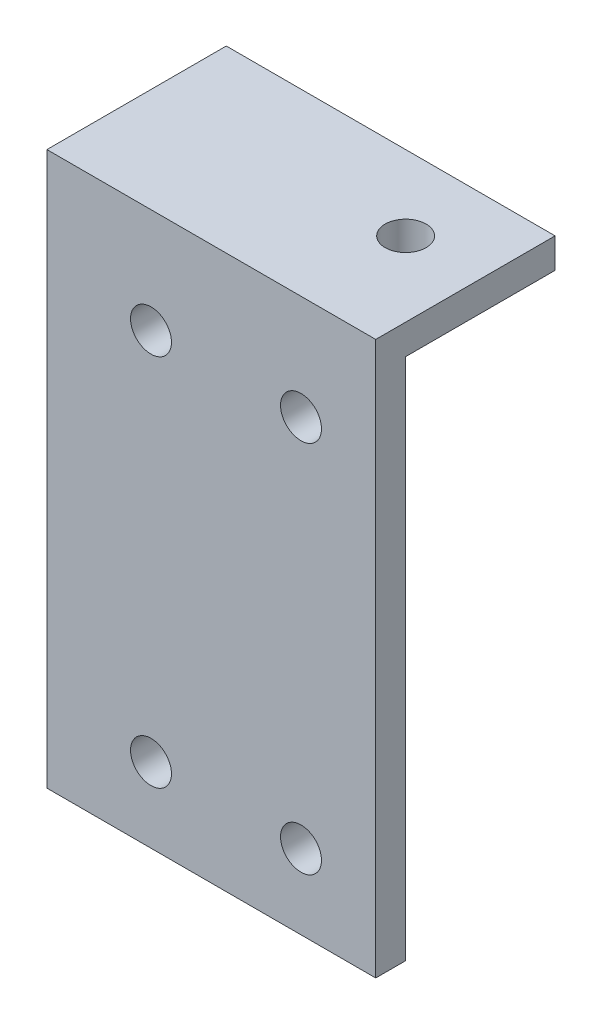
ISO-10303-21;
HEADER;
FILE_DESCRIPTION(('STEP AP214'),'2;1');
FILE_NAME('part.step','',(''),(''),'','','');
FILE_SCHEMA(('AUTOMOTIVE_DESIGN { 1 0 10303 214 1 1 1 1 }'));
ENDSEC;
DATA;
#1=APPLICATION_CONTEXT('core data for automotive mechanical design processes');
#2=APPLICATION_PROTOCOL_DEFINITION('international standard','automotive_design',2000,#1);
#3=PRODUCT_CONTEXT('',#1,'mechanical');
#4=PRODUCT('Part','Part','',(#3));
#5=PRODUCT_RELATED_PRODUCT_CATEGORY('part','',(#4));
#6=PRODUCT_DEFINITION_FORMATION('','',#4);
#7=PRODUCT_DEFINITION_CONTEXT('part definition',#1,'design');
#8=PRODUCT_DEFINITION('design','',#6,#7);
#9=PRODUCT_DEFINITION_SHAPE('','',#8);
#10=(LENGTH_UNIT() NAMED_UNIT(*) SI_UNIT(.MILLI.,.METRE.));
#11=(NAMED_UNIT(*) PLANE_ANGLE_UNIT() SI_UNIT($,.RADIAN.));
#12=(NAMED_UNIT(*) SI_UNIT($,.STERADIAN.) SOLID_ANGLE_UNIT());
#13=UNCERTAINTY_MEASURE_WITH_UNIT(LENGTH_MEASURE(1.E-05),#10,'distance_accuracy_value','');
#14=(GEOMETRIC_REPRESENTATION_CONTEXT(3) GLOBAL_UNCERTAINTY_ASSIGNED_CONTEXT((#13)) GLOBAL_UNIT_ASSIGNED_CONTEXT((#10,
#11,#12)) REPRESENTATION_CONTEXT('',''));
#15=CARTESIAN_POINT('',(0.,0.,0.));
#16=DIRECTION('',(0.,0.,1.));
#17=DIRECTION('',(1.,0.,0.));
#18=AXIS2_PLACEMENT_3D('',#15,#16,#17);
#19=CARTESIAN_POINT('',(0.,0.,4.));
#20=DIRECTION('',(0.,0.,-1.));
#21=DIRECTION('',(-1.,0.,0.));
#22=AXIS2_PLACEMENT_3D('',#19,#20,#21);
#23=PLANE('',#22);
#24=DIRECTION('',(0.,1.,0.));
#25=VECTOR('',#24,1.);
#26=CARTESIAN_POINT('',(-189.06817954727,-521.277483232161,4.));
#27=LINE('',#26,#25);
#28=CARTESIAN_POINT('',(-189.06817954727,-521.277483232161,4.));
#29=VERTEX_POINT('',#28);
#30=CARTESIAN_POINT('',(-189.06817954727,-447.27748323216,4.));
#31=VERTEX_POINT('',#30);
#32=EDGE_CURVE('E74',#29,#31,#27,.T.);
#33=ORIENTED_EDGE('',*,*,#32,.T.);
#34=DIRECTION('',(1.,0.,0.));
#35=VECTOR('',#34,1.);
#36=CARTESIAN_POINT('',(-229.06817954727,-447.27748323216,4.));
#37=LINE('',#36,#35);
#38=CARTESIAN_POINT('',(-233.06817954727,-447.27748323216,4.));
#39=VERTEX_POINT('',#38);
#40=EDGE_CURVE('E110',#39,#31,#37,.T.);
#41=ORIENTED_EDGE('',*,*,#40,.F.);
#42=DIRECTION('',(0.,1.,0.));
#43=VECTOR('',#42,1.);
#44=CARTESIAN_POINT('',(-233.06817954727,-447.27748323216,4.));
#45=LINE('',#44,#43);
#46=CARTESIAN_POINT('',(-233.06817954727,-521.277483232161,4.));
#47=VERTEX_POINT('',#46);
#48=EDGE_CURVE('E91',#47,#39,#45,.T.);
#49=ORIENTED_EDGE('',*,*,#48,.F.);
#50=DIRECTION('',(1.,0.,0.));
#51=VECTOR('',#50,1.);
#52=CARTESIAN_POINT('',(-229.06817954727,-521.277483232161,4.));
#53=LINE('',#52,#51);
#54=EDGE_CURVE('E42',#47,#29,#53,.T.);
#55=ORIENTED_EDGE('',*,*,#54,.T.);
#56=EDGE_LOOP('',(#33,#41,#49,#55));
#57=FACE_BOUND('',#56,.T.);
#58=CARTESIAN_POINT('',(-199.06817954727,-461.27748323216,4.));
#59=DIRECTION('',(0.,0.,1.));
#60=DIRECTION('',(1.,0.,0.));
#61=AXIS2_PLACEMENT_3D('',#58,#59,#60);
#62=CIRCLE('',#61,2.73999999999999);
#63=CARTESIAN_POINT('',(-196.32817954727,-461.27748323216,4.));
#64=VERTEX_POINT('',#63);
#65=EDGE_CURVE('E148',#64,#64,#62,.T.);
#66=ORIENTED_EDGE('',*,*,#65,.F.);
#67=EDGE_LOOP('',(#66));
#68=FACE_BOUND('',#67,.T.);
#69=CARTESIAN_POINT('',(-219.139101533085,-461.27748323216,4.));
#70=DIRECTION('',(0.,0.,1.));
#71=DIRECTION('',(1.,0.,0.));
#72=AXIS2_PLACEMENT_3D('',#69,#70,#71);
#73=CIRCLE('',#72,2.73999999999999);
#74=CARTESIAN_POINT('',(-216.399101533085,-461.27748323216,4.));
#75=VERTEX_POINT('',#74);
#76=EDGE_CURVE('E142',#75,#75,#73,.T.);
#77=ORIENTED_EDGE('',*,*,#76,.F.);
#78=EDGE_LOOP('',(#77));
#79=FACE_BOUND('',#78,.T.);
#80=CARTESIAN_POINT('',(-219.139101533085,-511.27748323216,4.));
#81=DIRECTION('',(0.,0.,1.));
#82=DIRECTION('',(1.,0.,0.));
#83=AXIS2_PLACEMENT_3D('',#80,#81,#82);
#84=CIRCLE('',#83,2.74000000000006);
#85=CARTESIAN_POINT('',(-216.399101533085,-511.27748323216,4.));
#86=VERTEX_POINT('',#85);
#87=EDGE_CURVE('E136',#86,#86,#84,.T.);
#88=ORIENTED_EDGE('',*,*,#87,.F.);
#89=EDGE_LOOP('',(#88));
#90=FACE_BOUND('',#89,.T.);
#91=CARTESIAN_POINT('',(-199.06817954727,-511.27748323216,4.));
#92=DIRECTION('',(0.,0.,1.));
#93=DIRECTION('',(1.,0.,0.));
#94=AXIS2_PLACEMENT_3D('',#91,#92,#93);
#95=CIRCLE('',#94,2.74000000000009);
#96=CARTESIAN_POINT('',(-196.32817954727,-511.27748323216,4.));
#97=VERTEX_POINT('',#96);
#98=EDGE_CURVE('E130',#97,#97,#95,.T.);
#99=ORIENTED_EDGE('',*,*,#98,.F.);
#100=EDGE_LOOP('',(#99));
#101=FACE_BOUND('',#100,.T.);
#102=ADVANCED_FACE('F33',(#57,#68,#79,#90,#101),#23,.F.);
#103=CARTESIAN_POINT('',(0.,0.,0.));
#104=DIRECTION('',(0.,0.,-1.));
#105=DIRECTION('',(-1.,0.,0.));
#106=AXIS2_PLACEMENT_3D('',#103,#104,#105);
#107=PLANE('',#106);
#108=CARTESIAN_POINT('',(-219.139101533085,-511.27748323216,0.));
#109=DIRECTION('',(0.,0.,1.));
#110=DIRECTION('',(1.,0.,0.));
#111=AXIS2_PLACEMENT_3D('',#108,#109,#110);
#112=CIRCLE('',#111,2.74000000000006);
#113=CARTESIAN_POINT('',(-216.399101533085,-511.27748323216,0.));
#114=VERTEX_POINT('',#113);
#115=EDGE_CURVE('E133',#114,#114,#112,.T.);
#116=ORIENTED_EDGE('',*,*,#115,.T.);
#117=EDGE_LOOP('',(#116));
#118=FACE_BOUND('',#117,.T.);
#119=CARTESIAN_POINT('',(-199.06817954727,-461.27748323216,0.));
#120=DIRECTION('',(0.,0.,1.));
#121=DIRECTION('',(1.,0.,0.));
#122=AXIS2_PLACEMENT_3D('',#119,#120,#121);
#123=CIRCLE('',#122,2.73999999999999);
#124=CARTESIAN_POINT('',(-196.32817954727,-461.27748323216,0.));
#125=VERTEX_POINT('',#124);
#126=EDGE_CURVE('E145',#125,#125,#123,.T.);
#127=ORIENTED_EDGE('',*,*,#126,.T.);
#128=EDGE_LOOP('',(#127));
#129=FACE_BOUND('',#128,.T.);
#130=DIRECTION('',(0.,1.,0.));
#131=VECTOR('',#130,1.);
#132=CARTESIAN_POINT('',(-189.06817954727,-521.277483232161,0.));
#133=LINE('',#132,#131);
#134=CARTESIAN_POINT('',(-189.06817954727,-521.277483232161,0.));
#135=VERTEX_POINT('',#134);
#136=CARTESIAN_POINT('',(-189.06817954727,-451.27748323216,0.));
#137=VERTEX_POINT('',#136);
#138=EDGE_CURVE('E71',#135,#137,#133,.T.);
#139=ORIENTED_EDGE('',*,*,#138,.F.);
#140=DIRECTION('',(1.,0.,0.));
#141=VECTOR('',#140,1.);
#142=CARTESIAN_POINT('',(-229.06817954727,-521.277483232161,0.));
#143=LINE('',#142,#141);
#144=CARTESIAN_POINT('',(-229.06817954727,-521.277483232161,0.));
#145=VERTEX_POINT('',#144);
#146=EDGE_CURVE('E63',#145,#135,#143,.T.);
#147=ORIENTED_EDGE('',*,*,#146,.F.);
#148=DIRECTION('',(0.,-1.,0.));
#149=VECTOR('',#148,1.);
#150=CARTESIAN_POINT('',(-229.06817954727,-521.277483232161,0.));
#151=LINE('',#150,#149);
#152=CARTESIAN_POINT('',(-229.06817954727,-451.27748323216,0.));
#153=VERTEX_POINT('',#152);
#154=EDGE_CURVE('E68',#153,#145,#151,.T.);
#155=ORIENTED_EDGE('',*,*,#154,.F.);
#156=DIRECTION('',(-1.,0.,0.));
#157=VECTOR('',#156,1.);
#158=CARTESIAN_POINT('',(-229.06817954727,-451.27748323216,0.));
#159=LINE('',#158,#157);
#160=EDGE_CURVE('E84',#137,#153,#159,.T.);
#161=ORIENTED_EDGE('',*,*,#160,.F.);
#162=EDGE_LOOP('',(#139,#147,#155,#161));
#163=FACE_BOUND('',#162,.T.);
#164=CARTESIAN_POINT('',(-219.139101533085,-461.27748323216,0.));
#165=DIRECTION('',(0.,0.,1.));
#166=DIRECTION('',(1.,0.,0.));
#167=AXIS2_PLACEMENT_3D('',#164,#165,#166);
#168=CIRCLE('',#167,2.73999999999999);
#169=CARTESIAN_POINT('',(-216.399101533085,-461.27748323216,0.));
#170=VERTEX_POINT('',#169);
#171=EDGE_CURVE('E139',#170,#170,#168,.T.);
#172=ORIENTED_EDGE('',*,*,#171,.T.);
#173=EDGE_LOOP('',(#172));
#174=FACE_BOUND('',#173,.T.);
#175=CARTESIAN_POINT('',(-199.06817954727,-511.27748323216,0.));
#176=DIRECTION('',(0.,0.,1.));
#177=DIRECTION('',(1.,0.,0.));
#178=AXIS2_PLACEMENT_3D('',#175,#176,#177);
#179=CIRCLE('',#178,2.74000000000009);
#180=CARTESIAN_POINT('',(-196.32817954727,-511.27748323216,0.));
#181=VERTEX_POINT('',#180);
#182=EDGE_CURVE('E129',#181,#181,#179,.T.);
#183=ORIENTED_EDGE('',*,*,#182,.T.);
#184=EDGE_LOOP('',(#183));
#185=FACE_BOUND('',#184,.T.);
#186=ADVANCED_FACE('F65',(#118,#129,#163,#174,#185),#107,.T.);
#187=CARTESIAN_POINT('',(-189.06817954727,-521.277483232161,4.));
#188=DIRECTION('',(-1.,0.,0.));
#189=DIRECTION('',(0.,0.,1.));
#190=AXIS2_PLACEMENT_3D('',#187,#188,#189);
#191=PLANE('',#190);
#192=ORIENTED_EDGE('',*,*,#138,.T.);
#193=DIRECTION('',(0.,0.,-1.));
#194=VECTOR('',#193,1.);
#195=CARTESIAN_POINT('',(-189.06817954727,-451.27748323216,4.));
#196=LINE('',#195,#194);
#197=CARTESIAN_POINT('',(-189.06817954727,-451.27748323216,-20.));
#198=VERTEX_POINT('',#197);
#199=EDGE_CURVE('E122',#137,#198,#196,.T.);
#200=ORIENTED_EDGE('',*,*,#199,.T.);
#201=DIRECTION('',(0.,-1.,0.));
#202=VECTOR('',#201,1.);
#203=CARTESIAN_POINT('',(-189.06817954727,-447.27748323216,-20.));
#204=LINE('',#203,#202);
#205=CARTESIAN_POINT('',(-189.06817954727,-447.27748323216,-20.));
#206=VERTEX_POINT('',#205);
#207=EDGE_CURVE('E120',#206,#198,#204,.T.);
#208=ORIENTED_EDGE('',*,*,#207,.F.);
#209=DIRECTION('',(0.,0.,-1.));
#210=VECTOR('',#209,1.);
#211=CARTESIAN_POINT('',(-189.06817954727,-447.27748323216,4.));
#212=LINE('',#211,#210);
#213=EDGE_CURVE('E113',#31,#206,#212,.T.);
#214=ORIENTED_EDGE('',*,*,#213,.F.);
#215=ORIENTED_EDGE('',*,*,#32,.F.);
#216=DIRECTION('',(0.,0.,-1.));
#217=VECTOR('',#216,1.);
#218=CARTESIAN_POINT('',(-189.06817954727,-521.277483232161,4.));
#219=LINE('',#218,#217);
#220=EDGE_CURVE('E11',#29,#135,#219,.T.);
#221=ORIENTED_EDGE('',*,*,#220,.T.);
#222=EDGE_LOOP('',(#192,#200,#208,#214,#215,#221));
#223=FACE_BOUND('',#222,.T.);
#224=ADVANCED_FACE('F35',(#223),#191,.F.);
#225=CARTESIAN_POINT('',(-229.06817954727,-521.277483232161,4.));
#226=DIRECTION('',(0.,1.,0.));
#227=DIRECTION('',(0.,0.,1.));
#228=AXIS2_PLACEMENT_3D('',#225,#226,#227);
#229=PLANE('',#228);
#230=ORIENTED_EDGE('',*,*,#146,.T.);
#231=ORIENTED_EDGE('',*,*,#220,.F.);
#232=ORIENTED_EDGE('',*,*,#54,.F.);
#233=DIRECTION('',(0.,0.,1.));
#234=VECTOR('',#233,1.);
#235=CARTESIAN_POINT('',(-233.06817954727,-521.277483232161,4.));
#236=LINE('',#235,#234);
#237=CARTESIAN_POINT('',(-233.06817954727,-521.277483232161,-20.));
#238=VERTEX_POINT('',#237);
#239=EDGE_CURVE('E104',#238,#47,#236,.T.);
#240=ORIENTED_EDGE('',*,*,#239,.F.);
#241=DIRECTION('',(1.,0.,0.));
#242=VECTOR('',#241,1.);
#243=CARTESIAN_POINT('',(-233.06817954727,-521.277483232161,-20.));
#244=LINE('',#243,#242);
#245=CARTESIAN_POINT('',(-229.06817954727,-521.277483232161,-20.));
#246=VERTEX_POINT('',#245);
#247=EDGE_CURVE('E90',#238,#246,#244,.T.);
#248=ORIENTED_EDGE('',*,*,#247,.T.);
#249=DIRECTION('',(0.,0.,1.));
#250=VECTOR('',#249,1.);
#251=CARTESIAN_POINT('',(-229.06817954727,-521.277483232161,4.));
#252=LINE('',#251,#250);
#253=EDGE_CURVE('E81',#246,#145,#252,.T.);
#254=ORIENTED_EDGE('',*,*,#253,.T.);
#255=EDGE_LOOP('',(#230,#231,#232,#240,#248,#254));
#256=FACE_BOUND('',#255,.T.);
#257=ADVANCED_FACE('F87',(#256),#229,.F.);
#258=CARTESIAN_POINT('',(-199.06817954727,-461.27748323216,4.));
#259=DIRECTION('',(0.,0.,-1.));
#260=DIRECTION('',(-1.,0.,0.));
#261=AXIS2_PLACEMENT_3D('',#258,#259,#260);
#262=CYLINDRICAL_SURFACE('',#261,2.73999999999999);
#263=ORIENTED_EDGE('',*,*,#65,.T.);
#264=EDGE_LOOP('',(#263));
#265=FACE_BOUND('',#264,.T.);
#266=ORIENTED_EDGE('',*,*,#126,.F.);
#267=EDGE_LOOP('',(#266));
#268=FACE_BOUND('',#267,.T.);
#269=ADVANCED_FACE('F232',(#265,#268),#262,.F.);
#270=CARTESIAN_POINT('',(-219.139101533085,-461.27748323216,4.));
#271=DIRECTION('',(0.,0.,-1.));
#272=DIRECTION('',(-1.,0.,0.));
#273=AXIS2_PLACEMENT_3D('',#270,#271,#272);
#274=CYLINDRICAL_SURFACE('',#273,2.73999999999999);
#275=ORIENTED_EDGE('',*,*,#76,.T.);
#276=EDGE_LOOP('',(#275));
#277=FACE_BOUND('',#276,.T.);
#278=ORIENTED_EDGE('',*,*,#171,.F.);
#279=EDGE_LOOP('',(#278));
#280=FACE_BOUND('',#279,.T.);
#281=ADVANCED_FACE('F239',(#277,#280),#274,.F.);
#282=CARTESIAN_POINT('',(-219.139101533085,-511.27748323216,4.));
#283=DIRECTION('',(0.,0.,-1.));
#284=DIRECTION('',(-1.,0.,0.));
#285=AXIS2_PLACEMENT_3D('',#282,#283,#284);
#286=CYLINDRICAL_SURFACE('',#285,2.74000000000006);
#287=ORIENTED_EDGE('',*,*,#87,.T.);
#288=EDGE_LOOP('',(#287));
#289=FACE_BOUND('',#288,.T.);
#290=ORIENTED_EDGE('',*,*,#115,.F.);
#291=EDGE_LOOP('',(#290));
#292=FACE_BOUND('',#291,.T.);
#293=ADVANCED_FACE('F332',(#289,#292),#286,.F.);
#294=CARTESIAN_POINT('',(-199.06817954727,-511.27748323216,4.));
#295=DIRECTION('',(0.,0.,-1.));
#296=DIRECTION('',(-1.,0.,0.));
#297=AXIS2_PLACEMENT_3D('',#294,#295,#296);
#298=CYLINDRICAL_SURFACE('',#297,2.74000000000009);
#299=ORIENTED_EDGE('',*,*,#98,.T.);
#300=EDGE_LOOP('',(#299));
#301=FACE_BOUND('',#300,.T.);
#302=ORIENTED_EDGE('',*,*,#182,.F.);
#303=EDGE_LOOP('',(#302));
#304=FACE_BOUND('',#303,.T.);
#305=ADVANCED_FACE('F252',(#301,#304),#298,.F.);
#306=CARTESIAN_POINT('',(0.,-447.27748323216,0.));
#307=DIRECTION('',(0.,-1.,0.));
#308=DIRECTION('',(0.,0.,-1.));
#309=AXIS2_PLACEMENT_3D('',#306,#307,#308);
#310=PLANE('',#309);
#311=DIRECTION('',(-1.,0.,0.));
#312=VECTOR('',#311,1.);
#313=CARTESIAN_POINT('',(-229.06817954727,-447.27748323216,-20.));
#314=LINE('',#313,#312);
#315=CARTESIAN_POINT('',(-233.06817954727,-447.27748323216,-20.));
#316=VERTEX_POINT('',#315);
#317=EDGE_CURVE('E117',#206,#316,#314,.T.);
#318=ORIENTED_EDGE('',*,*,#317,.T.);
#319=DIRECTION('',(0.,0.,-1.));
#320=VECTOR('',#319,1.);
#321=CARTESIAN_POINT('',(-233.06817954727,-447.27748323216,4.));
#322=LINE('',#321,#320);
#323=EDGE_CURVE('E95',#39,#316,#322,.T.);
#324=ORIENTED_EDGE('',*,*,#323,.F.);
#325=ORIENTED_EDGE('',*,*,#40,.T.);
#326=ORIENTED_EDGE('',*,*,#213,.T.);
#327=EDGE_LOOP('',(#318,#324,#325,#326));
#328=FACE_BOUND('',#327,.T.);
#329=CARTESIAN_POINT('',(-199.06817954727,-447.27748323216,-10.));
#330=DIRECTION('',(0.,1.,0.));
#331=DIRECTION('',(0.,0.,1.));
#332=AXIS2_PLACEMENT_3D('',#329,#330,#331);
#333=CIRCLE('',#332,2.74);
#334=CARTESIAN_POINT('',(-199.06817954727,-447.27748323216,-7.26));
#335=VERTEX_POINT('',#334);
#336=EDGE_CURVE('E105',#335,#335,#333,.T.);
#337=ORIENTED_EDGE('',*,*,#336,.F.);
#338=EDGE_LOOP('',(#337));
#339=FACE_BOUND('',#338,.T.);
#340=ADVANCED_FACE('F187',(#328,#339),#310,.F.);
#341=CARTESIAN_POINT('',(0.,-451.27748323216,0.));
#342=DIRECTION('',(0.,-1.,0.));
#343=DIRECTION('',(0.,0.,-1.));
#344=AXIS2_PLACEMENT_3D('',#341,#342,#343);
#345=PLANE('',#344);
#346=ORIENTED_EDGE('',*,*,#199,.F.);
#347=ORIENTED_EDGE('',*,*,#160,.T.);
#348=DIRECTION('',(0.,0.,1.));
#349=VECTOR('',#348,1.);
#350=CARTESIAN_POINT('',(-229.06817954727,-451.27748323216,4.));
#351=LINE('',#350,#349);
#352=CARTESIAN_POINT('',(-229.06817954727,-451.27748323216,-20.));
#353=VERTEX_POINT('',#352);
#354=EDGE_CURVE('E83',#353,#153,#351,.T.);
#355=ORIENTED_EDGE('',*,*,#354,.F.);
#356=DIRECTION('',(-1.,0.,0.));
#357=VECTOR('',#356,1.);
#358=CARTESIAN_POINT('',(-229.06817954727,-451.27748323216,-20.));
#359=LINE('',#358,#357);
#360=EDGE_CURVE('E114',#198,#353,#359,.T.);
#361=ORIENTED_EDGE('',*,*,#360,.F.);
#362=EDGE_LOOP('',(#346,#347,#355,#361));
#363=FACE_BOUND('',#362,.T.);
#364=CARTESIAN_POINT('',(-199.06817954727,-451.27748323216,-10.));
#365=DIRECTION('',(0.,1.,0.));
#366=DIRECTION('',(0.,0.,1.));
#367=AXIS2_PLACEMENT_3D('',#364,#365,#366);
#368=CIRCLE('',#367,2.74);
#369=CARTESIAN_POINT('',(-199.06817954727,-451.27748323216,-7.26));
#370=VERTEX_POINT('',#369);
#371=EDGE_CURVE('E103',#370,#370,#368,.T.);
#372=ORIENTED_EDGE('',*,*,#371,.T.);
#373=EDGE_LOOP('',(#372));
#374=FACE_BOUND('',#373,.T.);
#375=ADVANCED_FACE('F159',(#363,#374),#345,.T.);
#376=CARTESIAN_POINT('',(-229.06817954727,-447.27748323216,-20.));
#377=DIRECTION('',(0.,0.,1.));
#378=DIRECTION('',(1.,0.,0.));
#379=AXIS2_PLACEMENT_3D('',#376,#377,#378);
#380=PLANE('',#379);
#381=ORIENTED_EDGE('',*,*,#360,.T.);
#382=DIRECTION('',(0.,-1.,0.));
#383=VECTOR('',#382,1.);
#384=CARTESIAN_POINT('',(-229.06817954727,-447.27748323216,-20.));
#385=LINE('',#384,#383);
#386=EDGE_CURVE('E92',#353,#246,#385,.T.);
#387=ORIENTED_EDGE('',*,*,#386,.T.);
#388=ORIENTED_EDGE('',*,*,#247,.F.);
#389=DIRECTION('',(0.,-1.,0.));
#390=VECTOR('',#389,1.);
#391=CARTESIAN_POINT('',(-233.06817954727,-447.27748323216,-20.));
#392=LINE('',#391,#390);
#393=EDGE_CURVE('E179',#316,#238,#392,.T.);
#394=ORIENTED_EDGE('',*,*,#393,.F.);
#395=ORIENTED_EDGE('',*,*,#317,.F.);
#396=ORIENTED_EDGE('',*,*,#207,.T.);
#397=EDGE_LOOP('',(#381,#387,#388,#394,#395,#396));
#398=FACE_BOUND('',#397,.T.);
#399=ADVANCED_FACE('F218',(#398),#380,.F.);
#400=CARTESIAN_POINT('',(-199.06817954727,-447.27748323216,-10.));
#401=DIRECTION('',(0.,-1.,0.));
#402=DIRECTION('',(0.,0.,-1.));
#403=AXIS2_PLACEMENT_3D('',#400,#401,#402);
#404=CYLINDRICAL_SURFACE('',#403,2.74);
#405=ORIENTED_EDGE('',*,*,#336,.T.);
#406=EDGE_LOOP('',(#405));
#407=FACE_BOUND('',#406,.T.);
#408=ORIENTED_EDGE('',*,*,#371,.F.);
#409=EDGE_LOOP('',(#408));
#410=FACE_BOUND('',#409,.T.);
#411=ADVANCED_FACE('F209',(#407,#410),#404,.F.);
#412=CARTESIAN_POINT('',(-233.06817954727,0.,0.));
#413=DIRECTION('',(1.,0.,0.));
#414=DIRECTION('',(0.,1.,0.));
#415=AXIS2_PLACEMENT_3D('',#412,#413,#414);
#416=PLANE('',#415);
#417=ORIENTED_EDGE('',*,*,#48,.T.);
#418=ORIENTED_EDGE('',*,*,#323,.T.);
#419=ORIENTED_EDGE('',*,*,#393,.T.);
#420=ORIENTED_EDGE('',*,*,#239,.T.);
#421=EDGE_LOOP('',(#417,#418,#419,#420));
#422=FACE_BOUND('',#421,.T.);
#423=CARTESIAN_POINT('',(-233.06817954727,-461.27748323216,-10.));
#424=DIRECTION('',(-1.,0.,0.));
#425=DIRECTION('',(0.,-1.,0.));
#426=AXIS2_PLACEMENT_3D('',#423,#424,#425);
#427=CIRCLE('',#426,2.73999999999999);
#428=CARTESIAN_POINT('',(-233.06817954727,-464.01748323216,-10.));
#429=VERTEX_POINT('',#428);
#430=EDGE_CURVE('E98',#429,#429,#427,.T.);
#431=ORIENTED_EDGE('',*,*,#430,.F.);
#432=EDGE_LOOP('',(#431));
#433=FACE_BOUND('',#432,.T.);
#434=CARTESIAN_POINT('',(-233.06817954727,-511.27748323216,-10.));
#435=DIRECTION('',(-1.,0.,0.));
#436=DIRECTION('',(0.,-1.,0.));
#437=AXIS2_PLACEMENT_3D('',#434,#435,#436);
#438=CIRCLE('',#437,2.74000000000002);
#439=CARTESIAN_POINT('',(-233.06817954727,-514.017483232161,-10.));
#440=VERTEX_POINT('',#439);
#441=EDGE_CURVE('E196',#440,#440,#438,.T.);
#442=ORIENTED_EDGE('',*,*,#441,.F.);
#443=EDGE_LOOP('',(#442));
#444=FACE_BOUND('',#443,.T.);
#445=ADVANCED_FACE('F174',(#422,#433,#444),#416,.F.);
#446=CARTESIAN_POINT('',(-229.06817954727,0.,0.));
#447=DIRECTION('',(1.,0.,0.));
#448=DIRECTION('',(0.,1.,0.));
#449=AXIS2_PLACEMENT_3D('',#446,#447,#448);
#450=PLANE('',#449);
#451=CARTESIAN_POINT('',(-229.06817954727,-461.27748323216,-10.));
#452=DIRECTION('',(-1.,0.,0.));
#453=DIRECTION('',(0.,-1.,0.));
#454=AXIS2_PLACEMENT_3D('',#451,#452,#453);
#455=CIRCLE('',#454,2.73999999999999);
#456=CARTESIAN_POINT('',(-229.06817954727,-464.01748323216,-10.));
#457=VERTEX_POINT('',#456);
#458=EDGE_CURVE('E193',#457,#457,#455,.T.);
#459=ORIENTED_EDGE('',*,*,#458,.T.);
#460=EDGE_LOOP('',(#459));
#461=FACE_BOUND('',#460,.T.);
#462=ORIENTED_EDGE('',*,*,#354,.T.);
#463=ORIENTED_EDGE('',*,*,#154,.T.);
#464=ORIENTED_EDGE('',*,*,#253,.F.);
#465=ORIENTED_EDGE('',*,*,#386,.F.);
#466=EDGE_LOOP('',(#462,#463,#464,#465));
#467=FACE_BOUND('',#466,.T.);
#468=CARTESIAN_POINT('',(-229.06817954727,-511.27748323216,-10.));
#469=DIRECTION('',(-1.,0.,0.));
#470=DIRECTION('',(0.,-1.,0.));
#471=AXIS2_PLACEMENT_3D('',#468,#469,#470);
#472=CIRCLE('',#471,2.74000000000002);
#473=CARTESIAN_POINT('',(-229.06817954727,-514.017483232161,-10.));
#474=VERTEX_POINT('',#473);
#475=EDGE_CURVE('E199',#474,#474,#472,.T.);
#476=ORIENTED_EDGE('',*,*,#475,.T.);
#477=EDGE_LOOP('',(#476));
#478=FACE_BOUND('',#477,.T.);
#479=ADVANCED_FACE('F77',(#461,#467,#478),#450,.T.);
#480=CARTESIAN_POINT('',(-233.06817954727,-461.27748323216,-10.));
#481=DIRECTION('',(1.,0.,0.));
#482=DIRECTION('',(0.,1.,0.));
#483=AXIS2_PLACEMENT_3D('',#480,#481,#482);
#484=CYLINDRICAL_SURFACE('',#483,2.73999999999999);
#485=ORIENTED_EDGE('',*,*,#430,.T.);
#486=EDGE_LOOP('',(#485));
#487=FACE_BOUND('',#486,.T.);
#488=ORIENTED_EDGE('',*,*,#458,.F.);
#489=EDGE_LOOP('',(#488));
#490=FACE_BOUND('',#489,.T.);
#491=ADVANCED_FACE('F215',(#487,#490),#484,.F.);
#492=CARTESIAN_POINT('',(-233.06817954727,-511.27748323216,-10.));
#493=DIRECTION('',(1.,0.,0.));
#494=DIRECTION('',(0.,1.,0.));
#495=AXIS2_PLACEMENT_3D('',#492,#493,#494);
#496=CYLINDRICAL_SURFACE('',#495,2.74000000000002);
#497=ORIENTED_EDGE('',*,*,#441,.T.);
#498=EDGE_LOOP('',(#497));
#499=FACE_BOUND('',#498,.T.);
#500=ORIENTED_EDGE('',*,*,#475,.F.);
#501=EDGE_LOOP('',(#500));
#502=FACE_BOUND('',#501,.T.);
#503=ADVANCED_FACE('F205',(#499,#502),#496,.F.);
#504=CLOSED_SHELL('',(#102,#186,#224,#257,#269,#281,#293,#305,#340,#375,#399,#411,#445,#479,
#491,#503));
#505=MANIFOLD_SOLID_BREP('B2',#504);
#506=ADVANCED_BREP_SHAPE_REPRESENTATION('',(#18,#505),#14);
#507=SHAPE_DEFINITION_REPRESENTATION(#9,#506);
ENDSEC;
END-ISO-10303-21;
